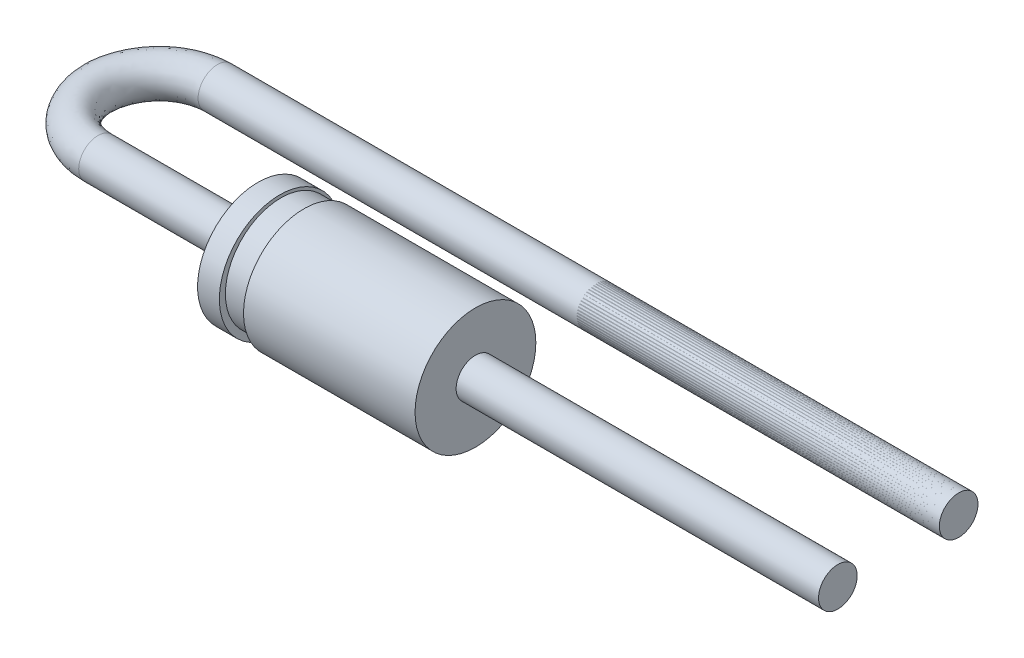
ISO-10303-21;
HEADER;
FILE_DESCRIPTION(('STEP AP214'),'2;1');
FILE_NAME('part.step','',(''),(''),'','','');
FILE_SCHEMA(('AUTOMOTIVE_DESIGN { 1 0 10303 214 1 1 1 1 }'));
ENDSEC;
DATA;
#1=APPLICATION_CONTEXT('core data for automotive mechanical design processes');
#2=APPLICATION_PROTOCOL_DEFINITION('international standard','automotive_design',2000,#1);
#3=PRODUCT_CONTEXT('',#1,'mechanical');
#4=PRODUCT('Part','Part','',(#3));
#5=PRODUCT_RELATED_PRODUCT_CATEGORY('part','',(#4));
#6=PRODUCT_DEFINITION_FORMATION('','',#4);
#7=PRODUCT_DEFINITION_CONTEXT('part definition',#1,'design');
#8=PRODUCT_DEFINITION('design','',#6,#7);
#9=PRODUCT_DEFINITION_SHAPE('','',#8);
#10=(LENGTH_UNIT() NAMED_UNIT(*) SI_UNIT(.MILLI.,.METRE.));
#11=(NAMED_UNIT(*) PLANE_ANGLE_UNIT() SI_UNIT($,.RADIAN.));
#12=(NAMED_UNIT(*) SI_UNIT($,.STERADIAN.) SOLID_ANGLE_UNIT());
#13=UNCERTAINTY_MEASURE_WITH_UNIT(LENGTH_MEASURE(1.E-05),#10,'distance_accuracy_value','');
#14=(GEOMETRIC_REPRESENTATION_CONTEXT(3) GLOBAL_UNCERTAINTY_ASSIGNED_CONTEXT((#13)) GLOBAL_UNIT_ASSIGNED_CONTEXT((#10,
#11,#12)) REPRESENTATION_CONTEXT('',''));
#15=CARTESIAN_POINT('',(0.,0.,0.));
#16=DIRECTION('',(0.,0.,1.));
#17=DIRECTION('',(1.,0.,0.));
#18=AXIS2_PLACEMENT_3D('',#15,#16,#17);
#19=CARTESIAN_POINT('',(7.45,0.,-0.975));
#20=DIRECTION('',(1.,0.,0.));
#21=DIRECTION('',(0.,0.,-1.));
#22=AXIS2_PLACEMENT_3D('',#19,#20,#21);
#23=CYLINDRICAL_SURFACE('',#22,0.4);
#24=CARTESIAN_POINT('',(7.45,0.,-0.975));
#25=DIRECTION('',(1.,0.,0.));
#26=DIRECTION('',(0.,0.,-1.));
#27=AXIS2_PLACEMENT_3D('',#24,#25,#26);
#28=CIRCLE('',#27,0.4);
#29=CARTESIAN_POINT('',(7.45,0.,-1.375));
#30=VERTEX_POINT('',#29);
#31=EDGE_CURVE('E12',#30,#30,#28,.T.);
#32=ORIENTED_EDGE('',*,*,#31,.T.);
#33=EDGE_LOOP('',(#32));
#34=FACE_BOUND('',#33,.T.);
#35=CARTESIAN_POINT('',(14.95,0.,-0.975));
#36=DIRECTION('',(1.,0.,0.));
#37=DIRECTION('',(0.,0.,-1.));
#38=AXIS2_PLACEMENT_3D('',#35,#36,#37);
#39=CIRCLE('',#38,0.4);
#40=CARTESIAN_POINT('',(14.95,0.,-1.375));
#41=VERTEX_POINT('',#40);
#42=EDGE_CURVE('E49',#41,#41,#39,.T.);
#43=ORIENTED_EDGE('',*,*,#42,.F.);
#44=EDGE_LOOP('',(#43));
#45=FACE_BOUND('',#44,.T.);
#46=ADVANCED_FACE('F46',(#34,#45),#23,.T.);
#47=CARTESIAN_POINT('',(7.45,0.,-0.975));
#48=DIRECTION('',(1.,0.,0.));
#49=DIRECTION('',(0.,0.,-1.));
#50=AXIS2_PLACEMENT_3D('',#47,#48,#49);
#51=PLANE('',#50);
#52=ORIENTED_EDGE('',*,*,#31,.F.);
#53=EDGE_LOOP('',(#52));
#54=FACE_BOUND('',#53,.T.);
#55=ADVANCED_FACE('F61',(#54),#51,.F.);
#56=CARTESIAN_POINT('',(14.95,0.,-0.975));
#57=DIRECTION('',(1.,0.,0.));
#58=DIRECTION('',(0.,0.,-1.));
#59=AXIS2_PLACEMENT_3D('',#56,#57,#58);
#60=PLANE('',#59);
#61=ORIENTED_EDGE('',*,*,#42,.T.);
#62=EDGE_LOOP('',(#61));
#63=FACE_BOUND('',#62,.T.);
#64=ADVANCED_FACE('F58',(#63),#60,.T.);
#65=CLOSED_SHELL('',(#46,#55,#64));
#66=MANIFOLD_SOLID_BREP('B2',#65);
#67=CARTESIAN_POINT('',(14.95,0.,-0.975));
#68=DIRECTION('',(-1.,0.,0.));
#69=DIRECTION('',(0.,0.,1.));
#70=AXIS2_PLACEMENT_3D('',#67,#68,#69);
#71=CYLINDRICAL_SURFACE('',#70,0.4);
#72=CARTESIAN_POINT('',(14.95,0.,-0.975));
#73=DIRECTION('',(1.,0.,0.));
#74=DIRECTION('',(0.,0.,-1.));
#75=AXIS2_PLACEMENT_3D('',#72,#73,#74);
#76=CIRCLE('',#75,0.4);
#77=CARTESIAN_POINT('',(14.95,0.,-1.375));
#78=VERTEX_POINT('',#77);
#79=EDGE_CURVE('E101',#78,#78,#76,.T.);
#80=ORIENTED_EDGE('',*,*,#79,.T.);
#81=EDGE_LOOP('',(#80));
#82=FACE_BOUND('',#81,.T.);
#83=CARTESIAN_POINT('',(-0.395308509352427,0.,-0.975));
#84=DIRECTION('',(-0.999901719717398,0.,0.0140196614149882));
#85=DIRECTION('',(-0.0140196614149882,0.,-0.999901719717398));
#86=AXIS2_PLACEMENT_3D('',#83,#84,#85);
#87=ELLIPSE('',#86,0.400039315977027,0.4);
#88=CARTESIAN_POINT('',(-0.400916925115108,0.,-1.375));
#89=VERTEX_POINT('',#88);
#90=EDGE_CURVE('E45',#89,#89,#87,.T.);
#91=ORIENTED_EDGE('',*,*,#90,.T.);
#92=EDGE_LOOP('',(#91));
#93=FACE_BOUND('',#92,.T.);
#94=ADVANCED_FACE('F94',(#82,#93),#71,.F.);
#95=CARTESIAN_POINT('',(-0.400916925115108,0.,-1.375));
#96=CARTESIAN_POINT('',(-0.456812184270277,0.,-1.37343227253864));
#97=CARTESIAN_POINT('',(-0.647022350070839,0.,-1.35804857595545));
#98=CARTESIAN_POINT('',(-0.876084600969926,0.,-1.30036748334841));
#99=CARTESIAN_POINT('',(-1.14127514743001,0.,-1.18980842470544));
#100=CARTESIAN_POINT('',(-1.37782439785229,0.,-1.03624933075071));
#101=CARTESIAN_POINT('',(-1.59806729128182,0.,-0.825789582540745));
#102=CARTESIAN_POINT('',(-1.76572115798352,0.,-0.594822499862731));
#103=CARTESIAN_POINT('',(-1.90105061045738,0.,-0.327230746502325));
#104=CARTESIAN_POINT('',(-1.99109046775209,0.,-0.0277906611981398));
#105=CARTESIAN_POINT('',(-2.02239653605656,0.,0.298059202789394));
#106=CARTESIAN_POINT('',(-1.98196741418329,0.,0.622903261778436));
#107=CARTESIAN_POINT('',(-1.88356597951284,0.,0.919701213193929));
#108=CARTESIAN_POINT('',(-1.74079353381916,0.,1.18339365779001));
#109=CARTESIAN_POINT('',(-1.566708508928,0.,1.40956931438695));
#110=CARTESIAN_POINT('',(-1.34072972020118,0.,1.61377217790345));
#111=CARTESIAN_POINT('',(-1.09965672295321,0.,1.76063607847936));
#112=CARTESIAN_POINT('',(-0.832513081319989,0.,1.8637260144226));
#113=CARTESIAN_POINT('',(-0.598929411850858,0.,1.91486354784486));
#114=CARTESIAN_POINT('',(-0.416173013289276,0.,1.925));
#115=CARTESIAN_POINT('',(-0.360255910835668,0.,1.925));
#116=CARTESIAN_POINT('',(-0.400916925115108,-0.800000000000001,-1.375));
#117=CARTESIAN_POINT('',(-0.39877331948029,-0.800000000000001,-1.37506012297771));
#118=CARTESIAN_POINT('',(-0.677306118690135,-0.800000000000001,-1.35719918914903));
#119=CARTESIAN_POINT('',(-0.866553343129275,-0.800000000000001,-1.30063481218379));
#120=CARTESIAN_POINT('',(-1.14428389902343,-0.800000000000001,-1.18972403647605));
#121=CARTESIAN_POINT('',(-1.37708607789343,-0.800000000000001,-1.03627003880928));
#122=CARTESIAN_POINT('',(-1.59826851134678,-0.800000000000001,-0.825783938932835));
#123=CARTESIAN_POINT('',(-1.76566320281262,-0.800000000000001,-0.594824124832307));
#124=CARTESIAN_POINT('',(-1.90106699298777,-0.800000000000001,-0.327230289121425));
#125=CARTESIAN_POINT('',(-1.99108562447277,-0.800000000000001,-0.0277907888321385));
#126=CARTESIAN_POINT('',(-2.02239889209058,-0.800000000000001,0.298059237388862));
#127=CARTESIAN_POINT('',(-1.98196295198909,-0.800000000000001,0.622903252757179));
#128=CARTESIAN_POINT('',(-1.88358089999557,-0.800000000000001,0.9197012155125));
#129=CARTESIAN_POINT('',(-1.74074079755044,-0.800000000000001,1.18339365720373));
#130=CARTESIAN_POINT('',(-1.56689159738006,-0.800000000000001,1.40956931453039));
#131=CARTESIAN_POINT('',(-1.34005793202056,-0.800000000000001,1.6137721778607));
#132=CARTESIAN_POINT('',(-1.10239434773754,-0.800000000000001,1.76063607849009));
#133=CARTESIAN_POINT('',(-0.823840711302692,-0.800000000000001,1.86372601442013));
#134=CARTESIAN_POINT('',(-0.626435402291764,-0.800000000000001,1.91486354784545));
#135=CARTESIAN_POINT('',(-0.363707636586288,-0.800000000000001,1.925));
#136=CARTESIAN_POINT('',(-0.360255910835668,-0.800000000000001,1.925));
#137=CARTESIAN_POINT('',(-0.389700093589746,-0.800000000000001,-0.574999999999999));
#138=CARTESIAN_POINT('',(-0.387556487954927,-0.800000000000001,-0.575060122977705));
#139=CARTESIAN_POINT('',(-0.522534556259445,-0.800000000000001,-0.566007387617043));
#140=CARTESIAN_POINT('',(-0.623656812158325,-0.800000000000001,-0.536546837130658));
#141=CARTESIAN_POINT('',(-0.760314232295891,-0.800000000000001,-0.482375342214705));
#142=CARTESIAN_POINT('',(-0.888269603512119,-0.800000000000001,-0.397184953694763));
#143=CARTESIAN_POINT('',(-0.986595351626484,-0.800000000000001,-0.302739246701492));
#144=CARTESIAN_POINT('',(-1.08085217018831,-0.800000000000001,-0.175237288238711));
#145=CARTESIAN_POINT('',(-1.15424103039334,-0.800000000000001,-0.0289469315467762));
#146=CARTESIAN_POINT('',(-1.20144642278028,-0.800000000000001,0.129729955677521));
#147=CARTESIAN_POINT('',(-1.21607431131628,-0.800000000000001,0.286753725924845));
#148=CARTESIAN_POINT('',(-1.19704972223058,-0.800000000000001,0.443305657386779));
#149=CARTESIAN_POINT('',(-1.14541434060943,-0.800000000000001,0.600596682843229));
#150=CARTESIAN_POINT('',(-1.06795209114412,-0.800000000000001,0.744771989974693));
#151=CARTESIAN_POINT('',(-0.970160261185067,-0.800000000000001,0.8695810880492));
#152=CARTESIAN_POINT('',(-0.86921561149342,-0.800000000000001,0.961233319811573));
#153=CARTESIAN_POINT('',(-0.738960461477552,-0.800000000000001,1.04280132289688));
#154=CARTESIAN_POINT('',(-0.600709576601502,-0.800000000000001,1.09312502941095));
#155=CARTESIAN_POINT('',(-0.499345577591779,-0.800000000000001,1.11968743662343));
#156=CARTESIAN_POINT('',(-0.363707636586289,-0.800000000000001,1.125));
#157=CARTESIAN_POINT('',(-0.360255910835669,-0.800000000000001,1.125));
#158=CARTESIAN_POINT('',(-0.389700093589746,0.,-0.574999999999999));
#159=CARTESIAN_POINT('',(-0.41657592034992,0.,-0.574246197758174));
#160=CARTESIAN_POINT('',(-0.507392671949798,0.,-0.566432081020251));
#161=CARTESIAN_POINT('',(-0.628422441078651,0.,-0.536413172712972));
#162=CARTESIAN_POINT('',(-0.758809856499181,0.,-0.482417536329402));
#163=CARTESIAN_POINT('',(-0.888638763491547,0.,-0.397174599665478));
#164=CARTESIAN_POINT('',(-0.986494741594002,0.,-0.302742068505447));
#165=CARTESIAN_POINT('',(-1.08088114777376,0.,-0.175236475753923));
#166=CARTESIAN_POINT('',(-1.15423283912814,0.,-0.0289471602372264));
#167=CARTESIAN_POINT('',(-1.20144884441994,0.,0.12973001949452));
#168=CARTESIAN_POINT('',(-1.21607313329926,0.,0.286753708625111));
#169=CARTESIAN_POINT('',(-1.19705195332768,0.,0.443305661897407));
#170=CARTESIAN_POINT('',(-1.14540688036807,0.,0.600596681683944));
#171=CARTESIAN_POINT('',(-1.06797845927848,0.,0.744771990267834));
#172=CARTESIAN_POINT('',(-0.970068716959038,0.,0.869581087977482));
#173=CARTESIAN_POINT('',(-0.86955150558373,0.,0.96123331983295));
#174=CARTESIAN_POINT('',(-0.737591649085388,0.,1.04280132289151));
#175=CARTESIAN_POINT('',(-0.60504576161015,0.,1.09312502941219));
#176=CARTESIAN_POINT('',(-0.485592582371327,0.,1.11968743662314));
#177=CARTESIAN_POINT('',(-0.389940324937783,0.,1.125));
#178=CARTESIAN_POINT('',(-0.360255910835669,0.,1.125));
#179=CARTESIAN_POINT('',(-0.389700093589746,0.800000000000001,-0.574999999999999));
#180=CARTESIAN_POINT('',(-0.445595352744914,0.800000000000001,-0.573432272538644));
#181=CARTESIAN_POINT('',(-0.49225078764015,0.800000000000001,-0.566856774423459));
#182=CARTESIAN_POINT('',(-0.633188069998977,0.800000000000001,-0.536279508295286));
#183=CARTESIAN_POINT('',(-0.75730548070247,0.800000000000001,-0.482459730444099));
#184=CARTESIAN_POINT('',(-0.889007923470977,0.800000000000001,-0.397164245636194));
#185=CARTESIAN_POINT('',(-0.986394131561519,0.800000000000001,-0.302744890309401));
#186=CARTESIAN_POINT('',(-1.08091012535921,0.800000000000001,-0.175235663269135));
#187=CARTESIAN_POINT('',(-1.15422464786295,0.800000000000001,-0.0289473889276768));
#188=CARTESIAN_POINT('',(-1.2014512660596,0.800000000000001,0.12973008331152));
#189=CARTESIAN_POINT('',(-1.21607195528225,0.800000000000001,0.286753691325377));
#190=CARTESIAN_POINT('',(-1.19705418442478,0.800000000000001,0.443305666408036));
#191=CARTESIAN_POINT('',(-1.1453994201267,0.800000000000001,0.600596680524658));
#192=CARTESIAN_POINT('',(-1.06800482741284,0.800000000000001,0.744771990560975));
#193=CARTESIAN_POINT('',(-0.969977172733008,0.800000000000001,0.869581087905763));
#194=CARTESIAN_POINT('',(-0.86988739967404,0.800000000000001,0.961233319854328));
#195=CARTESIAN_POINT('',(-0.736222836693223,0.800000000000001,1.04280132288615));
#196=CARTESIAN_POINT('',(-0.609381946618799,0.800000000000001,1.09312502941342));
#197=CARTESIAN_POINT('',(-0.471839587150874,0.800000000000001,1.11968743662284));
#198=CARTESIAN_POINT('',(-0.416173013289277,0.800000000000001,1.125));
#199=CARTESIAN_POINT('',(-0.360255910835669,0.800000000000001,1.125));
#200=CARTESIAN_POINT('',(-0.400916925115108,0.800000000000001,-1.375));
#201=CARTESIAN_POINT('',(-0.514851049060264,0.800000000000001,-1.37180442209958));
#202=CARTESIAN_POINT('',(-0.616738581451543,0.800000000000001,-1.35889796276186));
#203=CARTESIAN_POINT('',(-0.885615858810578,0.800000000000001,-1.30010015451304));
#204=CARTESIAN_POINT('',(-1.13826639583659,0.800000000000001,-1.18989281293483));
#205=CARTESIAN_POINT('',(-1.37856271781115,0.800000000000001,-1.03622862269214));
#206=CARTESIAN_POINT('',(-1.59786607121685,0.800000000000001,-0.825795226148654));
#207=CARTESIAN_POINT('',(-1.76577911315443,0.800000000000001,-0.594820874893155));
#208=CARTESIAN_POINT('',(-1.901034227927,0.800000000000001,-0.327231203883226));
#209=CARTESIAN_POINT('',(-1.99109531103141,0.800000000000001,-0.0277905335641409));
#210=CARTESIAN_POINT('',(-2.02239418002254,0.800000000000001,0.298059168189926));
#211=CARTESIAN_POINT('',(-1.98197187637749,0.800000000000001,0.622903270799693));
#212=CARTESIAN_POINT('',(-1.88355105903011,0.800000000000001,0.919701210875357));
#213=CARTESIAN_POINT('',(-1.74084627008788,0.800000000000001,1.1833936583763));
#214=CARTESIAN_POINT('',(-1.56652542047594,0.800000000000001,1.40956931424351));
#215=CARTESIAN_POINT('',(-1.3414015083818,0.800000000000001,1.61377217794621));
#216=CARTESIAN_POINT('',(-1.09691909816888,0.800000000000001,1.76063607846863));
#217=CARTESIAN_POINT('',(-0.841185451337287,0.800000000000001,1.86372601442506));
#218=CARTESIAN_POINT('',(-0.571423421409952,0.800000000000001,1.91486354784427));
#219=CARTESIAN_POINT('',(-0.468638389992264,0.800000000000001,1.925));
#220=CARTESIAN_POINT('',(-0.360255910835668,0.800000000000001,1.925));
#221=CARTESIAN_POINT('',(-0.400916925115108,0.,-1.375));
#222=CARTESIAN_POINT('',(-0.456812184270277,0.,-1.37343227253864));
#223=CARTESIAN_POINT('',(-0.647022350070839,0.,-1.35804857595545));
#224=CARTESIAN_POINT('',(-0.876084600969926,0.,-1.30036748334841));
#225=CARTESIAN_POINT('',(-1.14127514743001,0.,-1.18980842470544));
#226=CARTESIAN_POINT('',(-1.37782439785229,0.,-1.03624933075071));
#227=CARTESIAN_POINT('',(-1.59806729128182,0.,-0.825789582540745));
#228=CARTESIAN_POINT('',(-1.76572115798352,0.,-0.594822499862731));
#229=CARTESIAN_POINT('',(-1.90105061045738,0.,-0.327230746502325));
#230=CARTESIAN_POINT('',(-1.99109046775209,0.,-0.0277906611981398));
#231=CARTESIAN_POINT('',(-2.02239653605656,0.,0.298059202789394));
#232=CARTESIAN_POINT('',(-1.98196741418329,0.,0.622903261778436));
#233=CARTESIAN_POINT('',(-1.88356597951284,0.,0.919701213193929));
#234=CARTESIAN_POINT('',(-1.74079353381916,0.,1.18339365779001));
#235=CARTESIAN_POINT('',(-1.566708508928,0.,1.40956931438695));
#236=CARTESIAN_POINT('',(-1.34072972020118,0.,1.61377217790345));
#237=CARTESIAN_POINT('',(-1.09965672295321,0.,1.76063607847936));
#238=CARTESIAN_POINT('',(-0.832513081319989,0.,1.8637260144226));
#239=CARTESIAN_POINT('',(-0.598929411850858,0.,1.91486354784486));
#240=CARTESIAN_POINT('',(-0.416173013289276,0.,1.925));
#241=CARTESIAN_POINT('',(-0.360255910835668,0.,1.925));
#242=(BOUNDED_SURFACE() B_SPLINE_SURFACE(3,3,((#95,#96,#97,#98,#99,#100,#101,#102,#103,#104,
#105,#106,#107,#108,#109,#110,#111,#112,#113,#114,#115),(#116,#117,#118,#119,#120,#121,#122,
#123,#124,#125,#126,#127,#128,#129,#130,#131,#132,#133,#134,#135,#136),(#137,#138,#139,#140,
#141,#142,#143,#144,#145,#146,#147,#148,#149,#150,#151,#152,#153,#154,#155,#156,#157),(#158,
#159,#160,#161,#162,#163,#164,#165,#166,#167,#168,#169,#170,#171,#172,#173,#174,#175,#176,#177,
#178),(#179,#180,#181,#182,#183,#184,#185,#186,#187,#188,#189,#190,#191,#192,#193,#194,#195,
#196,#197,#198,#199),(#200,#201,#202,#203,#204,#205,#206,#207,#208,#209,#210,#211,#212,#213,
#214,#215,#216,#217,#218,#219,#220),(#221,#222,#223,#224,#225,#226,#227,#228,#229,#230,#231,
#232,#233,#234,#235,#236,#237,#238,#239,#240,#241)),.UNSPECIFIED.,.T.,.F.,
.F.) B_SPLINE_SURFACE_WITH_KNOTS((4,3,4),(4,1,1,1,1,1,1,1,1,1,1,1,1,1,1,1,1,1,4),(0.,0.5,1.),
(0.,0.043346238451417,0.0920421398674288,0.146133364197918,0.206265383349782,0.259796568302618,
0.31674469579196,0.376167530348792,0.437342824186047,0.500098474360678,0.562854124535291,
0.624029418372546,0.683452252929379,0.740400380418721,0.793931565371556,0.85406358452342,
0.908154808853909,0.956850710269921,1.),
.UNSPECIFIED.) GEOMETRIC_REPRESENTATION_ITEM() RATIONAL_B_SPLINE_SURFACE(((1.,1.,1.,1.,1.,1.,1.,
1.,1.,1.,1.,1.,1.,1.,1.,1.,1.,1.,1.,1.,1.),(0.333333333333333,0.333333333333333,
0.333333333333333,0.333333333333333,0.333333333333333,0.333333333333333,0.333333333333333,
0.333333333333333,0.333333333333333,0.333333333333333,0.333333333333333,0.333333333333333,
0.333333333333333,0.333333333333333,0.333333333333333,0.333333333333333,0.333333333333333,
0.333333333333333,0.333333333333333,0.333333333333333,0.333333333333333),(0.333333333333333,
0.333333333333333,0.333333333333333,0.333333333333333,0.333333333333333,0.333333333333333,
0.333333333333333,0.333333333333333,0.333333333333333,0.333333333333333,0.333333333333333,
0.333333333333333,0.333333333333333,0.333333333333333,0.333333333333333,0.333333333333333,
0.333333333333333,0.333333333333333,0.333333333333333,0.333333333333333,0.333333333333333),(1.,
1.,1.,1.,1.,1.,1.,1.,1.,1.,1.,1.,1.,1.,1.,1.,1.,1.,1.,1.,1.),(0.333333333333333,
0.333333333333333,0.333333333333333,0.333333333333333,0.333333333333333,0.333333333333333,
0.333333333333333,0.333333333333333,0.333333333333333,0.333333333333333,0.333333333333333,
0.333333333333333,0.333333333333333,0.333333333333333,0.333333333333333,0.333333333333333,
0.333333333333333,0.333333333333333,0.333333333333333,0.333333333333333,0.333333333333333),
(0.333333333333333,0.333333333333333,0.333333333333333,0.333333333333333,0.333333333333333,
0.333333333333333,0.333333333333333,0.333333333333333,0.333333333333333,0.333333333333333,
0.333333333333333,0.333333333333333,0.333333333333333,0.333333333333333,0.333333333333333,
0.333333333333333,0.333333333333333,0.333333333333333,0.333333333333333,0.333333333333333,
0.333333333333333),(1.,1.,1.,1.,1.,1.,1.,1.,1.,1.,1.,1.,1.,1.,1.,1.,1.,1.,1.,1.,1.))) REPRESENTATION_ITEM('') SURFACE());
#243=CARTESIAN_POINT('',(-0.360255910835668,0.,1.525));
#244=DIRECTION('',(-1.,0.,0.));
#245=DIRECTION('',(0.,0.,1.));
#246=AXIS2_PLACEMENT_3D('',#243,#244,#245);
#247=CIRCLE('',#246,0.4);
#248=CARTESIAN_POINT('',(-0.360255910835668,0.,1.925));
#249=VERTEX_POINT('',#248);
#250=EDGE_CURVE('E107',#249,#249,#247,.T.);
#251=ORIENTED_EDGE('',*,*,#90,.F.);
#252=EDGE_LOOP('',(#251));
#253=FACE_BOUND('',#252,.T.);
#254=ORIENTED_EDGE('',*,*,#250,.F.);
#255=EDGE_LOOP('',(#254));
#256=FACE_BOUND('',#255,.T.);
#257=ADVANCED_FACE('F95',(#253,#256),#242,.F.);
#258=CARTESIAN_POINT('',(-0.360255910835668,0.,1.525));
#259=DIRECTION('',(1.,0.,0.));
#260=DIRECTION('',(0.,0.,-1.));
#261=AXIS2_PLACEMENT_3D('',#258,#259,#260);
#262=CYLINDRICAL_SURFACE('',#261,0.4);
#263=ORIENTED_EDGE('',*,*,#250,.T.);
#264=EDGE_LOOP('',(#263));
#265=FACE_BOUND('',#264,.T.);
#266=CARTESIAN_POINT('',(2.95,0.,1.525));
#267=DIRECTION('',(1.,0.,0.));
#268=DIRECTION('',(0.,0.,-1.));
#269=AXIS2_PLACEMENT_3D('',#266,#267,#268);
#270=CIRCLE('',#269,0.4);
#271=CARTESIAN_POINT('',(2.95,0.,1.125));
#272=VERTEX_POINT('',#271);
#273=EDGE_CURVE('E98',#272,#272,#270,.T.);
#274=ORIENTED_EDGE('',*,*,#273,.T.);
#275=EDGE_LOOP('',(#274));
#276=FACE_BOUND('',#275,.T.);
#277=ADVANCED_FACE('F96',(#265,#276),#262,.F.);
#278=OPEN_SHELL('',(#94,#257,#277));
#279=SHELL_BASED_SURFACE_MODEL('B7',(#278));
#280=CARTESIAN_POINT('',(7.45,-0.0336492653327545,1.525));
#281=DIRECTION('',(1.,0.,0.));
#282=DIRECTION('',(0.,0.,-1.));
#283=AXIS2_PLACEMENT_3D('',#280,#281,#282);
#284=PLANE('',#283);
#285=CARTESIAN_POINT('',(7.45,-0.0336492653327545,1.525));
#286=DIRECTION('',(1.,0.,0.));
#287=DIRECTION('',(0.,0.,-1.));
#288=AXIS2_PLACEMENT_3D('',#285,#286,#287);
#289=CIRCLE('',#288,1.25);
#290=CARTESIAN_POINT('',(7.45,-0.0336492653327545,0.275));
#291=VERTEX_POINT('',#290);
#292=EDGE_CURVE('E93',#291,#291,#289,.T.);
#293=ORIENTED_EDGE('',*,*,#292,.T.);
#294=EDGE_LOOP('',(#293));
#295=FACE_BOUND('',#294,.T.);
#296=CARTESIAN_POINT('',(7.45,-0.0336492653327545,1.525));
#297=DIRECTION('',(1.,0.,0.));
#298=DIRECTION('',(0.,0.,-1.));
#299=AXIS2_PLACEMENT_3D('',#296,#297,#298);
#300=CIRCLE('',#299,0.4);
#301=CARTESIAN_POINT('',(7.45,-0.0336492653327545,1.125));
#302=VERTEX_POINT('',#301);
#303=EDGE_CURVE('E187',#302,#302,#300,.T.);
#304=ORIENTED_EDGE('',*,*,#303,.F.);
#305=EDGE_LOOP('',(#304));
#306=FACE_BOUND('',#305,.T.);
#307=ADVANCED_FACE('F156',(#295,#306),#284,.T.);
#308=CARTESIAN_POINT('',(7.45,-0.0336492653327545,1.525));
#309=DIRECTION('',(-1.,0.,0.));
#310=DIRECTION('',(0.,0.,1.));
#311=AXIS2_PLACEMENT_3D('',#308,#309,#310);
#312=CYLINDRICAL_SURFACE('',#311,1.25);
#313=CARTESIAN_POINT('',(2.95,-0.0336492653327545,1.525));
#314=DIRECTION('',(1.,0.,0.));
#315=DIRECTION('',(0.,0.,-1.));
#316=AXIS2_PLACEMENT_3D('',#313,#314,#315);
#317=CIRCLE('',#316,1.25);
#318=CARTESIAN_POINT('',(2.95,-0.0336492653327545,0.275));
#319=VERTEX_POINT('',#318);
#320=EDGE_CURVE('E164',#319,#319,#317,.T.);
#321=ORIENTED_EDGE('',*,*,#320,.T.);
#322=EDGE_LOOP('',(#321));
#323=FACE_BOUND('',#322,.T.);
#324=CARTESIAN_POINT('',(3.4,-0.0336492653327545,1.525));
#325=DIRECTION('',(1.,0.,0.));
#326=DIRECTION('',(0.,0.,-1.));
#327=AXIS2_PLACEMENT_3D('',#324,#325,#326);
#328=CIRCLE('',#327,1.25);
#329=CARTESIAN_POINT('',(3.4,-0.0336492653327545,0.275));
#330=VERTEX_POINT('',#329);
#331=EDGE_CURVE('E160',#330,#330,#328,.T.);
#332=ORIENTED_EDGE('',*,*,#331,.F.);
#333=EDGE_LOOP('',(#332));
#334=FACE_BOUND('',#333,.T.);
#335=ADVANCED_FACE('F158',(#323,#334),#312,.T.);
#336=CARTESIAN_POINT('',(2.95,-0.0336492653327545,1.525));
#337=DIRECTION('',(1.,0.,0.));
#338=DIRECTION('',(0.,0.,-1.));
#339=AXIS2_PLACEMENT_3D('',#336,#337,#338);
#340=PLANE('',#339);
#341=ORIENTED_EDGE('',*,*,#320,.F.);
#342=EDGE_LOOP('',(#341));
#343=FACE_BOUND('',#342,.T.);
#344=ADVANCED_FACE('F200',(#343),#340,.F.);
#345=CARTESIAN_POINT('',(3.4,0.,-0.15));
#346=DIRECTION('',(1.,0.,0.));
#347=DIRECTION('',(0.,0.,-1.));
#348=AXIS2_PLACEMENT_3D('',#345,#346,#347);
#349=PLANE('',#348);
#350=CARTESIAN_POINT('',(3.4,0.,1.5));
#351=DIRECTION('',(-1.,0.,0.));
#352=DIRECTION('',(0.,0.,1.));
#353=AXIS2_PLACEMENT_3D('',#350,#351,#352);
#354=CIRCLE('',#353,1.15);
#355=CARTESIAN_POINT('',(3.4,0.,2.65));
#356=VERTEX_POINT('',#355);
#357=EDGE_CURVE('E171',#356,#356,#354,.T.);
#358=ORIENTED_EDGE('',*,*,#357,.T.);
#359=EDGE_LOOP('',(#358));
#360=FACE_BOUND('',#359,.T.);
#361=ORIENTED_EDGE('',*,*,#331,.T.);
#362=EDGE_LOOP('',(#361));
#363=FACE_BOUND('',#362,.T.);
#364=ADVANCED_FACE('F204',(#360,#363),#349,.T.);
#365=CARTESIAN_POINT('',(3.9,0.,-0.15));
#366=DIRECTION('',(-1.,0.,0.));
#367=DIRECTION('',(0.,0.,1.));
#368=AXIS2_PLACEMENT_3D('',#365,#366,#367);
#369=PLANE('',#368);
#370=CARTESIAN_POINT('',(3.9,0.,1.5));
#371=DIRECTION('',(-1.,0.,0.));
#372=DIRECTION('',(0.,0.,1.));
#373=AXIS2_PLACEMENT_3D('',#370,#371,#372);
#374=CIRCLE('',#373,1.15);
#375=CARTESIAN_POINT('',(3.9,0.,2.65));
#376=VERTEX_POINT('',#375);
#377=EDGE_CURVE('E179',#376,#376,#374,.T.);
#378=ORIENTED_EDGE('',*,*,#377,.F.);
#379=EDGE_LOOP('',(#378));
#380=FACE_BOUND('',#379,.T.);
#381=CARTESIAN_POINT('',(3.9,-0.0336492653327545,1.525));
#382=DIRECTION('',(-1.,0.,0.));
#383=DIRECTION('',(0.,0.,1.));
#384=AXIS2_PLACEMENT_3D('',#381,#382,#383);
#385=CIRCLE('',#384,1.25);
#386=CARTESIAN_POINT('',(3.9,-0.0336492653327545,2.775));
#387=VERTEX_POINT('',#386);
#388=EDGE_CURVE('E173',#387,#387,#385,.T.);
#389=ORIENTED_EDGE('',*,*,#388,.T.);
#390=EDGE_LOOP('',(#389));
#391=FACE_BOUND('',#390,.T.);
#392=ADVANCED_FACE('F211',(#380,#391),#369,.T.);
#393=CARTESIAN_POINT('',(0.,0.,1.5));
#394=DIRECTION('',(-1.,0.,0.));
#395=DIRECTION('',(0.,0.,1.));
#396=AXIS2_PLACEMENT_3D('',#393,#394,#395);
#397=CYLINDRICAL_SURFACE('',#396,1.15);
#398=ORIENTED_EDGE('',*,*,#377,.T.);
#399=EDGE_LOOP('',(#398));
#400=FACE_BOUND('',#399,.T.);
#401=ORIENTED_EDGE('',*,*,#357,.F.);
#402=EDGE_LOOP('',(#401));
#403=FACE_BOUND('',#402,.T.);
#404=ADVANCED_FACE('F219',(#400,#403),#397,.T.);
#405=ORIENTED_EDGE('',*,*,#292,.F.);
#406=EDGE_LOOP('',(#405));
#407=FACE_BOUND('',#406,.T.);
#408=ORIENTED_EDGE('',*,*,#388,.F.);
#409=EDGE_LOOP('',(#408));
#410=FACE_BOUND('',#409,.T.);
#411=ADVANCED_FACE('F202',(#407,#410),#312,.T.);
#412=CARTESIAN_POINT('',(14.95,-0.0336492653327545,1.525));
#413=DIRECTION('',(-1.,0.,0.));
#414=DIRECTION('',(0.,0.,1.));
#415=AXIS2_PLACEMENT_3D('',#412,#413,#414);
#416=CYLINDRICAL_SURFACE('',#415,0.4);
#417=CARTESIAN_POINT('',(14.95,-0.0336492653327545,1.525));
#418=DIRECTION('',(1.,0.,0.));
#419=DIRECTION('',(0.,0.,-1.));
#420=AXIS2_PLACEMENT_3D('',#417,#418,#419);
#421=CIRCLE('',#420,0.4);
#422=CARTESIAN_POINT('',(14.95,-0.0336492653327545,1.125));
#423=VERTEX_POINT('',#422);
#424=EDGE_CURVE('E183',#423,#423,#421,.T.);
#425=ORIENTED_EDGE('',*,*,#424,.F.);
#426=EDGE_LOOP('',(#425));
#427=FACE_BOUND('',#426,.T.);
#428=ORIENTED_EDGE('',*,*,#303,.T.);
#429=EDGE_LOOP('',(#428));
#430=FACE_BOUND('',#429,.T.);
#431=ADVANCED_FACE('F193',(#427,#430),#416,.T.);
#432=CARTESIAN_POINT('',(14.95,-0.0336492653327545,1.525));
#433=DIRECTION('',(1.,0.,0.));
#434=DIRECTION('',(0.,0.,-1.));
#435=AXIS2_PLACEMENT_3D('',#432,#433,#434);
#436=PLANE('',#435);
#437=ORIENTED_EDGE('',*,*,#424,.T.);
#438=EDGE_LOOP('',(#437));
#439=FACE_BOUND('',#438,.T.);
#440=ADVANCED_FACE('F228',(#439),#436,.T.);
#441=CLOSED_SHELL('',(#307,#335,#344,#364,#392,#404,#411,#431,#440));
#442=MANIFOLD_SOLID_BREP('B40',#441);
#443=ADVANCED_BREP_SHAPE_REPRESENTATION('',(#18,#66,#442),#14);
#444=MANIFOLD_SURFACE_SHAPE_REPRESENTATION('',(#18,#279),#14);
#445=SHAPE_REPRESENTATION('',(#18),#14);
#446=SHAPE_DEFINITION_REPRESENTATION(#9,#445);
#447=SHAPE_REPRESENTATION_RELATIONSHIP('','',#445,#443);
#448=SHAPE_REPRESENTATION_RELATIONSHIP('','',#445,#444);
ENDSEC;
END-ISO-10303-21;
